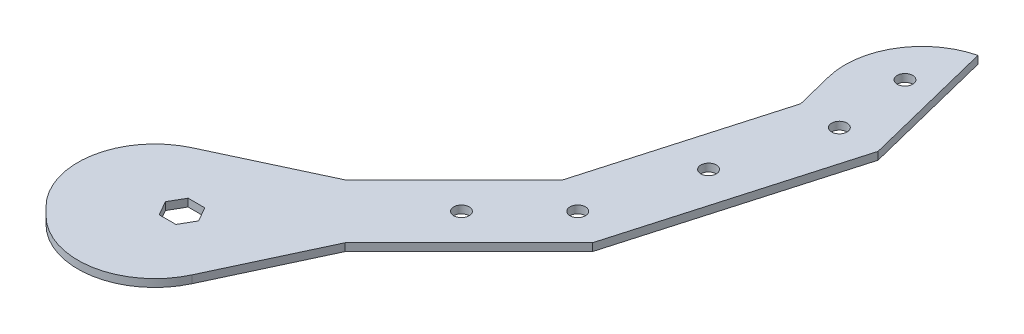
ISO-10303-21;
HEADER;
FILE_DESCRIPTION(('STEP AP214'),'2;1');
FILE_NAME('part.step','',(''),(''),'','','');
FILE_SCHEMA(('AUTOMOTIVE_DESIGN { 1 0 10303 214 1 1 1 1 }'));
ENDSEC;
DATA;
#1=APPLICATION_CONTEXT('core data for automotive mechanical design processes');
#2=APPLICATION_PROTOCOL_DEFINITION('international standard','automotive_design',2000,#1);
#3=PRODUCT_CONTEXT('',#1,'mechanical');
#4=PRODUCT('Part','Part','',(#3));
#5=PRODUCT_RELATED_PRODUCT_CATEGORY('part','',(#4));
#6=PRODUCT_DEFINITION_FORMATION('','',#4);
#7=PRODUCT_DEFINITION_CONTEXT('part definition',#1,'design');
#8=PRODUCT_DEFINITION('design','',#6,#7);
#9=PRODUCT_DEFINITION_SHAPE('','',#8);
#10=(LENGTH_UNIT() NAMED_UNIT(*) SI_UNIT(.MILLI.,.METRE.));
#11=(NAMED_UNIT(*) PLANE_ANGLE_UNIT() SI_UNIT($,.RADIAN.));
#12=(NAMED_UNIT(*) SI_UNIT($,.STERADIAN.) SOLID_ANGLE_UNIT());
#13=UNCERTAINTY_MEASURE_WITH_UNIT(LENGTH_MEASURE(1.E-05),#10,'distance_accuracy_value','');
#14=(GEOMETRIC_REPRESENTATION_CONTEXT(3) GLOBAL_UNCERTAINTY_ASSIGNED_CONTEXT((#13)) GLOBAL_UNIT_ASSIGNED_CONTEXT((#10,
#11,#12)) REPRESENTATION_CONTEXT('',''));
#15=CARTESIAN_POINT('',(0.,0.,0.));
#16=DIRECTION('',(0.,0.,1.));
#17=DIRECTION('',(1.,0.,0.));
#18=AXIS2_PLACEMENT_3D('',#15,#16,#17);
#19=CARTESIAN_POINT('',(0.,2.54,0.));
#20=DIRECTION('',(0.,1.,0.));
#21=DIRECTION('',(0.,0.,1.));
#22=AXIS2_PLACEMENT_3D('',#19,#20,#21);
#23=PLANE('',#22);
#24=CARTESIAN_POINT('',(84.5316637515031,2.54,-177.691526293164));
#25=DIRECTION('',(0.,1.,0.));
#26=DIRECTION('',(0.,0.,1.));
#27=AXIS2_PLACEMENT_3D('',#24,#25,#26);
#28=CIRCLE('',#27,2.55269999999999);
#29=CARTESIAN_POINT('',(84.5316637515031,2.54,-175.138826293164));
#30=VERTEX_POINT('',#29);
#31=EDGE_CURVE('E282',#30,#30,#28,.T.);
#32=ORIENTED_EDGE('',*,*,#31,.F.);
#33=EDGE_LOOP('',(#32));
#34=FACE_BOUND('',#33,.T.);
#35=CARTESIAN_POINT('',(87.3624440002007,2.54,-153.213816399814));
#36=DIRECTION('',(0.,1.,0.));
#37=DIRECTION('',(0.,0.,1.));
#38=AXIS2_PLACEMENT_3D('',#35,#36,#37);
#39=CIRCLE('',#38,2.55269999999999);
#40=CARTESIAN_POINT('',(87.3624440002007,2.54,-150.661116399814));
#41=VERTEX_POINT('',#40);
#42=EDGE_CURVE('E281',#41,#41,#39,.T.);
#43=ORIENTED_EDGE('',*,*,#42,.F.);
#44=EDGE_LOOP('',(#43));
#45=FACE_BOUND('',#44,.T.);
#46=CARTESIAN_POINT('',(77.7358093482921,2.54,-119.641751669168));
#47=DIRECTION('',(0.,1.,0.));
#48=DIRECTION('',(0.,0.,1.));
#49=AXIS2_PLACEMENT_3D('',#46,#47,#48);
#50=CIRCLE('',#49,2.55269999999999);
#51=CARTESIAN_POINT('',(77.7358093482921,2.54,-117.089051669168));
#52=VERTEX_POINT('',#51);
#53=EDGE_CURVE('E277',#52,#52,#50,.T.);
#54=ORIENTED_EDGE('',*,*,#53,.F.);
#55=EDGE_LOOP('',(#54));
#56=FACE_BOUND('',#55,.T.);
#57=CARTESIAN_POINT('',(68.1091746963835,2.54,-86.0696869385226));
#58=DIRECTION('',(0.,1.,0.));
#59=DIRECTION('',(0.,0.,1.));
#60=AXIS2_PLACEMENT_3D('',#57,#58,#59);
#61=CIRCLE('',#60,2.55269999999999);
#62=CARTESIAN_POINT('',(68.1091746963835,2.54,-83.5169869385226));
#63=VERTEX_POINT('',#62);
#64=EDGE_CURVE('E273',#63,#63,#61,.T.);
#65=ORIENTED_EDGE('',*,*,#64,.F.);
#66=EDGE_LOOP('',(#65));
#67=FACE_BOUND('',#66,.T.);
#68=CARTESIAN_POINT('',(48.917853565316,2.54,-66.878365807455));
#69=DIRECTION('',(0.,1.,0.));
#70=DIRECTION('',(0.,0.,1.));
#71=AXIS2_PLACEMENT_3D('',#68,#69,#70);
#72=CIRCLE('',#71,2.55269999999999);
#73=CARTESIAN_POINT('',(48.917853565316,2.54,-64.325665807455));
#74=VERTEX_POINT('',#73);
#75=EDGE_CURVE('E269',#74,#74,#72,.T.);
#76=ORIENTED_EDGE('',*,*,#75,.F.);
#77=EDGE_LOOP('',(#76));
#78=FACE_BOUND('',#77,.T.);
#79=DIRECTION('',(0.707106781186549,0.,0.707106781186546));
#80=VECTOR('',#79,1.);
#81=CARTESIAN_POINT('',(7.27589213157509,2.54,28.6451323527004));
#82=LINE('',#81,#80);
#83=CARTESIAN_POINT('',(-20.9634214125138,2.54,0.405818808611656));
#84=VERTEX_POINT('',#83);
#85=CARTESIAN_POINT('',(-18.3663310507512,2.54,3.00290917037422));
#86=VERTEX_POINT('',#85);
#87=EDGE_CURVE('E305',#84,#86,#82,.T.);
#88=ORIENTED_EDGE('',*,*,#87,.T.);
#89=CARTESIAN_POINT('',(-0.40581880861296,2.54,-14.9576030717641));
#90=DIRECTION('',(0.,1.,0.));
#91=DIRECTION('',(0.,0.,1.));
#92=AXIS2_PLACEMENT_3D('',#89,#90,#91);
#93=CIRCLE('',#92,25.4);
#94=CARTESIAN_POINT('',(22.6112329472668,2.54,-4.2163122523537));
#95=VERTEX_POINT('',#94);
#96=EDGE_CURVE('E48',#86,#95,#93,.T.);
#97=ORIENTED_EDGE('',*,*,#96,.T.);
#98=DIRECTION('',(0.42288546533112,0.,-0.906183139995267));
#99=VECTOR('',#98,1.);
#100=CARTESIAN_POINT('',(38.7067885553171,2.54,-38.7067885553189));
#101=LINE('',#100,#99);
#102=CARTESIAN_POINT('',(38.7067885553171,2.54,-38.7067885553189));
#103=VERTEX_POINT('',#102);
#104=EDGE_CURVE('E301',#95,#103,#101,.T.);
#105=ORIENTED_EDGE('',*,*,#104,.T.);
#106=DIRECTION('',(0.707106781186561,0.,-0.707106781186534));
#107=VECTOR('',#106,1.);
#108=CARTESIAN_POINT('',(38.7067885553171,2.54,-38.7067885553189));
#109=LINE('',#108,#107);
#110=CARTESIAN_POINT('',(79.5510485953113,2.54,-79.5510485953116));
#111=VERTEX_POINT('',#110);
#112=EDGE_CURVE('E304',#103,#111,#109,.T.);
#113=ORIENTED_EDGE('',*,*,#112,.T.);
#114=DIRECTION('',(0.27563735581699,0.,-0.961261695938322));
#115=VECTOR('',#114,1.);
#116=CARTESIAN_POINT('',(79.5510485953113,2.54,-79.5510485953116));
#117=LINE('',#116,#115);
#118=CARTESIAN_POINT('',(100.554615108566,2.54,-152.799189825811));
#119=VERTEX_POINT('',#118);
#120=EDGE_CURVE('E241',#111,#119,#117,.T.);
#121=ORIENTED_EDGE('',*,*,#120,.T.);
#122=DIRECTION('',(-0.241921895599665,0.,-0.970295726275997));
#123=VECTOR('',#122,1.);
#124=CARTESIAN_POINT('',(89.5985601168979,2.54,-196.741526293163));
#125=LINE('',#124,#123);
#126=CARTESIAN_POINT('',(89.5985601168979,2.54,-196.741526293163));
#127=VERTEX_POINT('',#126);
#128=EDGE_CURVE('E246',#119,#127,#125,.T.);
#129=ORIENTED_EDGE('',*,*,#128,.T.);
#130=CARTESIAN_POINT('',(95.7433762651295,2.54,-172.096014845753));
#131=DIRECTION('',(0.,1.,0.));
#132=DIRECTION('',(0.,0.,1.));
#133=AXIS2_PLACEMENT_3D('',#130,#131,#132);
#134=CIRCLE('',#133,25.4);
#135=CARTESIAN_POINT('',(71.0978648177191,2.54,-165.951198697521));
#136=VERTEX_POINT('',#135);
#137=EDGE_CURVE('E259',#127,#136,#134,.T.);
#138=ORIENTED_EDGE('',*,*,#137,.T.);
#139=DIRECTION('',(0.241921895599665,0.,0.970295726275997));
#140=VECTOR('',#139,1.);
#141=CARTESIAN_POINT('',(74.1702728918349,2.54,-153.628442973816));
#142=LINE('',#141,#140);
#143=CARTESIAN_POINT('',(74.1702728918349,2.54,-153.628442973816));
#144=VERTEX_POINT('',#143);
#145=EDGE_CURVE('E369',#136,#144,#142,.T.);
#146=ORIENTED_EDGE('',*,*,#145,.T.);
#147=DIRECTION('',(-0.275637355817012,0.,0.961261695938315));
#148=VECTOR('',#147,1.);
#149=CARTESIAN_POINT('',(74.1702728918349,2.54,-153.628442973816));
#150=LINE('',#149,#148);
#151=CARTESIAN_POINT('',(56.6673007974548,2.54,-92.5883252817334));
#152=VERTEX_POINT('',#151);
#153=EDGE_CURVE('E374',#144,#152,#150,.T.);
#154=ORIENTED_EDGE('',*,*,#153,.T.);
#155=DIRECTION('',(-0.707106781186546,0.,0.707106781186549));
#156=VECTOR('',#155,1.);
#157=CARTESIAN_POINT('',(56.6673007974548,2.54,-92.5883252817334));
#158=LINE('',#157,#156);
#159=CARTESIAN_POINT('',(20.7462763131782,2.54,-56.6673007974566));
#160=VERTEX_POINT('',#159);
#161=EDGE_CURVE('E376',#152,#160,#158,.T.);
#162=ORIENTED_EDGE('',*,*,#161,.T.);
#163=DIRECTION('',(-0.906183139995263,0.,0.422885465331128));
#164=VECTOR('',#163,1.);
#165=CARTESIAN_POINT('',(-46.60564459484,2.54,-25.2364043737144));
#166=LINE('',#165,#164);
#167=CARTESIAN_POINT('',(-13.7441999897862,2.54,-40.5717451894064));
#168=VERTEX_POINT('',#167);
#169=EDGE_CURVE('E384',#160,#168,#166,.T.);
#170=ORIENTED_EDGE('',*,*,#169,.T.);
#171=CARTESIAN_POINT('',(-3.00290917037553,2.54,-17.5546934335267));
#172=DIRECTION('',(0.,1.,0.));
#173=DIRECTION('',(0.,0.,1.));
#174=AXIS2_PLACEMENT_3D('',#171,#172,#173);
#175=CIRCLE('',#174,25.4);
#176=EDGE_CURVE('E292',#168,#84,#175,.T.);
#177=ORIENTED_EDGE('',*,*,#176,.T.);
#178=EDGE_LOOP('',(#88,#97,#105,#113,#121,#129,#138,#146,#154,#162,#170,#177));
#179=FACE_BOUND('',#178,.T.);
#180=DIRECTION('',(-0.5,0.,-0.866025403784439));
#181=VECTOR('',#180,1.);
#182=CARTESIAN_POINT('',(8.2850253850727,2.54,-20.7462763131799));
#183=LINE('',#182,#181);
#184=CARTESIAN_POINT('',(8.2850253850727,2.54,-20.7462763131799));
#185=VERTEX_POINT('',#184);
#186=CARTESIAN_POINT('',(5.53539472805711,2.54,-25.5087763131799));
#187=VERTEX_POINT('',#186);
#188=EDGE_CURVE('E179',#185,#187,#183,.T.);
#189=ORIENTED_EDGE('',*,*,#188,.F.);
#190=DIRECTION('',(0.5,0.,-0.866025403784439));
#191=VECTOR('',#190,1.);
#192=CARTESIAN_POINT('',(5.53539472805711,2.54,-15.9837763131799));
#193=LINE('',#192,#191);
#194=CARTESIAN_POINT('',(5.53539472805711,2.54,-15.9837763131799));
#195=VERTEX_POINT('',#194);
#196=EDGE_CURVE('E168',#195,#185,#193,.T.);
#197=ORIENTED_EDGE('',*,*,#196,.F.);
#198=DIRECTION('',(1.,0.,0.));
#199=VECTOR('',#198,1.);
#200=CARTESIAN_POINT('',(0.0361334140259219,2.54,-15.9837763131799));
#201=LINE('',#200,#199);
#202=CARTESIAN_POINT('',(0.0361334140259219,2.54,-15.9837763131799));
#203=VERTEX_POINT('',#202);
#204=EDGE_CURVE('E212',#203,#195,#201,.T.);
#205=ORIENTED_EDGE('',*,*,#204,.F.);
#206=DIRECTION('',(0.5,0.,0.866025403784439));
#207=VECTOR('',#206,1.);
#208=CARTESIAN_POINT('',(-2.71349724298967,2.54,-20.7462763131799));
#209=LINE('',#208,#207);
#210=CARTESIAN_POINT('',(-2.71349724298967,2.54,-20.7462763131799));
#211=VERTEX_POINT('',#210);
#212=EDGE_CURVE('E216',#211,#203,#209,.T.);
#213=ORIENTED_EDGE('',*,*,#212,.F.);
#214=DIRECTION('',(-0.5,0.,0.866025403784439));
#215=VECTOR('',#214,1.);
#216=CARTESIAN_POINT('',(0.0361334140259232,2.54,-25.5087763131799));
#217=LINE('',#216,#215);
#218=CARTESIAN_POINT('',(0.0361334140259232,2.54,-25.5087763131799));
#219=VERTEX_POINT('',#218);
#220=EDGE_CURVE('E197',#219,#211,#217,.T.);
#221=ORIENTED_EDGE('',*,*,#220,.F.);
#222=DIRECTION('',(-1.,0.,0.));
#223=VECTOR('',#222,1.);
#224=CARTESIAN_POINT('',(5.53539472805711,2.54,-25.5087763131799));
#225=LINE('',#224,#223);
#226=EDGE_CURVE('E192',#187,#219,#225,.T.);
#227=ORIENTED_EDGE('',*,*,#226,.F.);
#228=EDGE_LOOP('',(#189,#197,#205,#213,#221,#227));
#229=FACE_BOUND('',#228,.T.);
#230=ADVANCED_FACE('F40',(#34,#45,#56,#67,#78,#179,#229),#23,.T.);
#231=CARTESIAN_POINT('',(0.,0.,0.));
#232=DIRECTION('',(0.,1.,0.));
#233=DIRECTION('',(0.,0.,1.));
#234=AXIS2_PLACEMENT_3D('',#231,#232,#233);
#235=PLANE('',#234);
#236=CARTESIAN_POINT('',(84.5316637515031,0.,-177.691526293164));
#237=DIRECTION('',(0.,1.,0.));
#238=DIRECTION('',(0.,0.,1.));
#239=AXIS2_PLACEMENT_3D('',#236,#237,#238);
#240=CIRCLE('',#239,2.55269999999999);
#241=CARTESIAN_POINT('',(84.5316637515031,0.,-175.138826293164));
#242=VERTEX_POINT('',#241);
#243=EDGE_CURVE('E278',#242,#242,#240,.T.);
#244=ORIENTED_EDGE('',*,*,#243,.T.);
#245=EDGE_LOOP('',(#244));
#246=FACE_BOUND('',#245,.T.);
#247=CARTESIAN_POINT('',(87.3624440002007,0.,-153.213816399814));
#248=DIRECTION('',(0.,1.,0.));
#249=DIRECTION('',(0.,0.,1.));
#250=AXIS2_PLACEMENT_3D('',#247,#248,#249);
#251=CIRCLE('',#250,2.55269999999999);
#252=CARTESIAN_POINT('',(87.3624440002007,0.,-150.661116399814));
#253=VERTEX_POINT('',#252);
#254=EDGE_CURVE('E672',#253,#253,#251,.T.);
#255=ORIENTED_EDGE('',*,*,#254,.T.);
#256=EDGE_LOOP('',(#255));
#257=FACE_BOUND('',#256,.T.);
#258=CARTESIAN_POINT('',(77.7358093482921,0.,-119.641751669168));
#259=DIRECTION('',(0.,1.,0.));
#260=DIRECTION('',(0.,0.,1.));
#261=AXIS2_PLACEMENT_3D('',#258,#259,#260);
#262=CIRCLE('',#261,2.55269999999999);
#263=CARTESIAN_POINT('',(77.7358093482921,0.,-117.089051669168));
#264=VERTEX_POINT('',#263);
#265=EDGE_CURVE('E274',#264,#264,#262,.T.);
#266=ORIENTED_EDGE('',*,*,#265,.T.);
#267=EDGE_LOOP('',(#266));
#268=FACE_BOUND('',#267,.T.);
#269=CARTESIAN_POINT('',(68.1091746963835,0.,-86.0696869385226));
#270=DIRECTION('',(0.,1.,0.));
#271=DIRECTION('',(0.,0.,1.));
#272=AXIS2_PLACEMENT_3D('',#269,#270,#271);
#273=CIRCLE('',#272,2.55269999999999);
#274=CARTESIAN_POINT('',(68.1091746963835,0.,-83.5169869385226));
#275=VERTEX_POINT('',#274);
#276=EDGE_CURVE('E270',#275,#275,#273,.T.);
#277=ORIENTED_EDGE('',*,*,#276,.T.);
#278=EDGE_LOOP('',(#277));
#279=FACE_BOUND('',#278,.T.);
#280=CARTESIAN_POINT('',(48.917853565316,0.,-66.878365807455));
#281=DIRECTION('',(0.,1.,0.));
#282=DIRECTION('',(0.,0.,1.));
#283=AXIS2_PLACEMENT_3D('',#280,#281,#282);
#284=CIRCLE('',#283,2.55269999999999);
#285=CARTESIAN_POINT('',(48.917853565316,0.,-64.325665807455));
#286=VERTEX_POINT('',#285);
#287=EDGE_CURVE('E220',#286,#286,#284,.T.);
#288=ORIENTED_EDGE('',*,*,#287,.T.);
#289=EDGE_LOOP('',(#288));
#290=FACE_BOUND('',#289,.T.);
#291=DIRECTION('',(0.42288546533112,0.,-0.906183139995267));
#292=VECTOR('',#291,1.);
#293=CARTESIAN_POINT('',(38.7067885553171,0.,-38.7067885553189));
#294=LINE('',#293,#292);
#295=CARTESIAN_POINT('',(22.6112329472668,0.,-4.2163122523537));
#296=VERTEX_POINT('',#295);
#297=CARTESIAN_POINT('',(38.7067885553171,0.,-38.7067885553189));
#298=VERTEX_POINT('',#297);
#299=EDGE_CURVE('E327',#296,#298,#294,.T.);
#300=ORIENTED_EDGE('',*,*,#299,.F.);
#301=CARTESIAN_POINT('',(-0.40581880861296,0.,-14.9576030717641));
#302=DIRECTION('',(0.,1.,0.));
#303=DIRECTION('',(0.,0.,1.));
#304=AXIS2_PLACEMENT_3D('',#301,#302,#303);
#305=CIRCLE('',#304,25.4);
#306=CARTESIAN_POINT('',(-18.3663310507512,0.,3.00290917037422));
#307=VERTEX_POINT('',#306);
#308=EDGE_CURVE('E287',#296,#307,#305,.F.);
#309=ORIENTED_EDGE('',*,*,#308,.T.);
#310=DIRECTION('',(0.707106781186549,0.,0.707106781186546));
#311=VECTOR('',#310,1.);
#312=CARTESIAN_POINT('',(7.27589213157509,0.,28.6451323527004));
#313=LINE('',#312,#311);
#314=CARTESIAN_POINT('',(-20.9634214125138,0.,0.405818808611656));
#315=VERTEX_POINT('',#314);
#316=EDGE_CURVE('E325',#315,#307,#313,.T.);
#317=ORIENTED_EDGE('',*,*,#316,.F.);
#318=CARTESIAN_POINT('',(-3.00290917037553,0.,-17.5546934335267));
#319=DIRECTION('',(0.,1.,0.));
#320=DIRECTION('',(0.,0.,1.));
#321=AXIS2_PLACEMENT_3D('',#318,#319,#320);
#322=CIRCLE('',#321,25.4);
#323=CARTESIAN_POINT('',(-13.7441999897862,0.,-40.5717451894064));
#324=VERTEX_POINT('',#323);
#325=EDGE_CURVE('E285',#315,#324,#322,.F.);
#326=ORIENTED_EDGE('',*,*,#325,.T.);
#327=DIRECTION('',(-0.906183139995263,0.,0.422885465331128));
#328=VECTOR('',#327,1.);
#329=CARTESIAN_POINT('',(-46.60564459484,0.,-25.2364043737144));
#330=LINE('',#329,#328);
#331=CARTESIAN_POINT('',(20.7462763131782,0.,-56.6673007974566));
#332=VERTEX_POINT('',#331);
#333=EDGE_CURVE('E323',#332,#324,#330,.T.);
#334=ORIENTED_EDGE('',*,*,#333,.F.);
#335=DIRECTION('',(-0.707106781186546,0.,0.707106781186549));
#336=VECTOR('',#335,1.);
#337=CARTESIAN_POINT('',(56.6673007974548,0.,-92.5883252817334));
#338=LINE('',#337,#336);
#339=CARTESIAN_POINT('',(56.6673007974548,0.,-92.5883252817334));
#340=VERTEX_POINT('',#339);
#341=EDGE_CURVE('E321',#340,#332,#338,.T.);
#342=ORIENTED_EDGE('',*,*,#341,.F.);
#343=DIRECTION('',(-0.275637355817012,0.,0.961261695938315));
#344=VECTOR('',#343,1.);
#345=CARTESIAN_POINT('',(74.1702728918349,0.,-153.628442973816));
#346=LINE('',#345,#344);
#347=CARTESIAN_POINT('',(74.1702728918349,0.,-153.628442973816));
#348=VERTEX_POINT('',#347);
#349=EDGE_CURVE('E319',#348,#340,#346,.T.);
#350=ORIENTED_EDGE('',*,*,#349,.F.);
#351=DIRECTION('',(0.241921895599665,0.,0.970295726275997));
#352=VECTOR('',#351,1.);
#353=CARTESIAN_POINT('',(74.1702728918349,0.,-153.628442973816));
#354=LINE('',#353,#352);
#355=CARTESIAN_POINT('',(71.0978648177191,0.,-165.951198697521));
#356=VERTEX_POINT('',#355);
#357=EDGE_CURVE('E317',#356,#348,#354,.T.);
#358=ORIENTED_EDGE('',*,*,#357,.F.);
#359=CARTESIAN_POINT('',(95.7433762651295,0.,-172.096014845753));
#360=DIRECTION('',(0.,1.,0.));
#361=DIRECTION('',(0.,0.,1.));
#362=AXIS2_PLACEMENT_3D('',#359,#360,#361);
#363=CIRCLE('',#362,25.4);
#364=CARTESIAN_POINT('',(89.5985601168979,0.,-196.741526293163));
#365=VERTEX_POINT('',#364);
#366=EDGE_CURVE('E265',#356,#365,#363,.F.);
#367=ORIENTED_EDGE('',*,*,#366,.T.);
#368=DIRECTION('',(-0.241921895599665,0.,-0.970295726275997));
#369=VECTOR('',#368,1.);
#370=CARTESIAN_POINT('',(89.5985601168979,0.,-196.741526293163));
#371=LINE('',#370,#369);
#372=CARTESIAN_POINT('',(100.554615108566,0.,-152.799189825811));
#373=VERTEX_POINT('',#372);
#374=EDGE_CURVE('E314',#373,#365,#371,.T.);
#375=ORIENTED_EDGE('',*,*,#374,.F.);
#376=DIRECTION('',(0.27563735581699,0.,-0.961261695938322));
#377=VECTOR('',#376,1.);
#378=CARTESIAN_POINT('',(79.5510485953113,0.,-79.5510485953116));
#379=LINE('',#378,#377);
#380=CARTESIAN_POINT('',(79.5510485953113,0.,-79.5510485953116));
#381=VERTEX_POINT('',#380);
#382=EDGE_CURVE('E187',#381,#373,#379,.T.);
#383=ORIENTED_EDGE('',*,*,#382,.F.);
#384=DIRECTION('',(0.707106781186561,0.,-0.707106781186534));
#385=VECTOR('',#384,1.);
#386=CARTESIAN_POINT('',(38.7067885553171,0.,-38.7067885553189));
#387=LINE('',#386,#385);
#388=EDGE_CURVE('E247',#298,#381,#387,.T.);
#389=ORIENTED_EDGE('',*,*,#388,.F.);
#390=EDGE_LOOP('',(#300,#309,#317,#326,#334,#342,#350,#358,#367,#375,#383,#389));
#391=FACE_BOUND('',#390,.T.);
#392=DIRECTION('',(0.5,0.,-0.866025403784439));
#393=VECTOR('',#392,1.);
#394=CARTESIAN_POINT('',(5.53539472805711,0.,-15.9837763131799));
#395=LINE('',#394,#393);
#396=CARTESIAN_POINT('',(5.53539472805711,0.,-15.9837763131799));
#397=VERTEX_POINT('',#396);
#398=CARTESIAN_POINT('',(8.2850253850727,0.,-20.7462763131799));
#399=VERTEX_POINT('',#398);
#400=EDGE_CURVE('E218',#397,#399,#395,.T.);
#401=ORIENTED_EDGE('',*,*,#400,.T.);
#402=DIRECTION('',(-0.5,0.,-0.866025403784439));
#403=VECTOR('',#402,1.);
#404=CARTESIAN_POINT('',(8.2850253850727,0.,-20.7462763131799));
#405=LINE('',#404,#403);
#406=CARTESIAN_POINT('',(5.53539472805711,0.,-25.5087763131799));
#407=VERTEX_POINT('',#406);
#408=EDGE_CURVE('E186',#399,#407,#405,.T.);
#409=ORIENTED_EDGE('',*,*,#408,.T.);
#410=DIRECTION('',(-1.,0.,0.));
#411=VECTOR('',#410,1.);
#412=CARTESIAN_POINT('',(5.53539472805711,0.,-25.5087763131799));
#413=LINE('',#412,#411);
#414=CARTESIAN_POINT('',(0.0361334140259232,0.,-25.5087763131799));
#415=VERTEX_POINT('',#414);
#416=EDGE_CURVE('E222',#407,#415,#413,.T.);
#417=ORIENTED_EDGE('',*,*,#416,.T.);
#418=DIRECTION('',(-0.5,0.,0.866025403784439));
#419=VECTOR('',#418,1.);
#420=CARTESIAN_POINT('',(0.0361334140259232,0.,-25.5087763131799));
#421=LINE('',#420,#419);
#422=CARTESIAN_POINT('',(-2.71349724298967,0.,-20.7462763131799));
#423=VERTEX_POINT('',#422);
#424=EDGE_CURVE('E225',#415,#423,#421,.T.);
#425=ORIENTED_EDGE('',*,*,#424,.T.);
#426=DIRECTION('',(0.5,0.,0.866025403784439));
#427=VECTOR('',#426,1.);
#428=CARTESIAN_POINT('',(-2.71349724298967,0.,-20.7462763131799));
#429=LINE('',#428,#427);
#430=CARTESIAN_POINT('',(0.0361334140259219,0.,-15.9837763131799));
#431=VERTEX_POINT('',#430);
#432=EDGE_CURVE('E228',#423,#431,#429,.T.);
#433=ORIENTED_EDGE('',*,*,#432,.T.);
#434=DIRECTION('',(1.,0.,0.));
#435=VECTOR('',#434,1.);
#436=CARTESIAN_POINT('',(0.0361334140259219,0.,-15.9837763131799));
#437=LINE('',#436,#435);
#438=EDGE_CURVE('E180',#431,#397,#437,.T.);
#439=ORIENTED_EDGE('',*,*,#438,.T.);
#440=EDGE_LOOP('',(#401,#409,#417,#425,#433,#439));
#441=FACE_BOUND('',#440,.T.);
#442=ADVANCED_FACE('F357',(#246,#257,#268,#279,#290,#391,#441),#235,.F.);
#443=CARTESIAN_POINT('',(79.5510485953113,2.54,-79.5510485953116));
#444=DIRECTION('',(-0.961261695938322,0.,-0.27563735581699));
#445=DIRECTION('',(-0.27563735581699,0.,0.961261695938322));
#446=AXIS2_PLACEMENT_3D('',#443,#444,#445);
#447=PLANE('',#446);
#448=ORIENTED_EDGE('',*,*,#382,.T.);
#449=DIRECTION('',(0.,-1.,0.));
#450=VECTOR('',#449,1.);
#451=CARTESIAN_POINT('',(100.554615108566,2.54,-152.799189825811));
#452=LINE('',#451,#450);
#453=EDGE_CURVE('E347',#119,#373,#452,.T.);
#454=ORIENTED_EDGE('',*,*,#453,.F.);
#455=ORIENTED_EDGE('',*,*,#120,.F.);
#456=DIRECTION('',(0.,-1.,0.));
#457=VECTOR('',#456,1.);
#458=CARTESIAN_POINT('',(79.5510485953113,2.54,-79.5510485953116));
#459=LINE('',#458,#457);
#460=EDGE_CURVE('E311',#111,#381,#459,.T.);
#461=ORIENTED_EDGE('',*,*,#460,.T.);
#462=EDGE_LOOP('',(#448,#454,#455,#461));
#463=FACE_BOUND('',#462,.T.);
#464=ADVANCED_FACE('F415',(#463),#447,.F.);
#465=CARTESIAN_POINT('',(89.5985601168979,2.54,-196.741526293163));
#466=DIRECTION('',(-0.970295726275997,0.,0.241921895599665));
#467=DIRECTION('',(0.241921895599665,0.,0.970295726275997));
#468=AXIS2_PLACEMENT_3D('',#465,#466,#467);
#469=PLANE('',#468);
#470=ORIENTED_EDGE('',*,*,#374,.T.);
#471=DIRECTION('',(0.,-1.,0.));
#472=VECTOR('',#471,1.);
#473=CARTESIAN_POINT('',(89.5985601168979,2.54,-196.741526293163));
#474=LINE('',#473,#472);
#475=EDGE_CURVE('E344',#127,#365,#474,.T.);
#476=ORIENTED_EDGE('',*,*,#475,.F.);
#477=ORIENTED_EDGE('',*,*,#128,.F.);
#478=ORIENTED_EDGE('',*,*,#453,.T.);
#479=EDGE_LOOP('',(#470,#476,#477,#478));
#480=FACE_BOUND('',#479,.T.);
#481=ADVANCED_FACE('F364',(#480),#469,.F.);
#482=CARTESIAN_POINT('',(74.1702728918349,2.54,-153.628442973816));
#483=DIRECTION('',(0.970295726275997,0.,-0.241921895599665));
#484=DIRECTION('',(-0.241921895599665,0.,-0.970295726275997));
#485=AXIS2_PLACEMENT_3D('',#482,#483,#484);
#486=PLANE('',#485);
#487=ORIENTED_EDGE('',*,*,#145,.F.);
#488=DIRECTION('',(0.,-1.,0.));
#489=VECTOR('',#488,1.);
#490=CARTESIAN_POINT('',(71.0978648177191,2.54,-165.951198697521));
#491=LINE('',#490,#489);
#492=EDGE_CURVE('E349',#136,#356,#491,.T.);
#493=ORIENTED_EDGE('',*,*,#492,.T.);
#494=ORIENTED_EDGE('',*,*,#357,.T.);
#495=DIRECTION('',(0.,-1.,0.));
#496=VECTOR('',#495,1.);
#497=CARTESIAN_POINT('',(74.1702728918349,2.54,-153.628442973816));
#498=LINE('',#497,#496);
#499=EDGE_CURVE('E341',#144,#348,#498,.T.);
#500=ORIENTED_EDGE('',*,*,#499,.F.);
#501=EDGE_LOOP('',(#487,#493,#494,#500));
#502=FACE_BOUND('',#501,.T.);
#503=ADVANCED_FACE('F371',(#502),#486,.F.);
#504=CARTESIAN_POINT('',(74.1702728918349,2.54,-153.628442973816));
#505=DIRECTION('',(0.961261695938315,0.,0.275637355817012));
#506=DIRECTION('',(0.275637355817012,0.,-0.961261695938315));
#507=AXIS2_PLACEMENT_3D('',#504,#505,#506);
#508=PLANE('',#507);
#509=ORIENTED_EDGE('',*,*,#349,.T.);
#510=DIRECTION('',(0.,-1.,0.));
#511=VECTOR('',#510,1.);
#512=CARTESIAN_POINT('',(56.6673007974548,2.54,-92.5883252817334));
#513=LINE('',#512,#511);
#514=EDGE_CURVE('E338',#152,#340,#513,.T.);
#515=ORIENTED_EDGE('',*,*,#514,.F.);
#516=ORIENTED_EDGE('',*,*,#153,.F.);
#517=ORIENTED_EDGE('',*,*,#499,.T.);
#518=EDGE_LOOP('',(#509,#515,#516,#517));
#519=FACE_BOUND('',#518,.T.);
#520=ADVANCED_FACE('F407',(#519),#508,.F.);
#521=CARTESIAN_POINT('',(56.6673007974548,2.54,-92.5883252817334));
#522=DIRECTION('',(0.707106781186549,0.,0.707106781186546));
#523=DIRECTION('',(0.707106781186546,0.,-0.707106781186549));
#524=AXIS2_PLACEMENT_3D('',#521,#522,#523);
#525=PLANE('',#524);
#526=ORIENTED_EDGE('',*,*,#341,.T.);
#527=DIRECTION('',(0.,-1.,0.));
#528=VECTOR('',#527,1.);
#529=CARTESIAN_POINT('',(20.7462763131782,2.54,-56.6673007974566));
#530=LINE('',#529,#528);
#531=EDGE_CURVE('E335',#160,#332,#530,.T.);
#532=ORIENTED_EDGE('',*,*,#531,.F.);
#533=ORIENTED_EDGE('',*,*,#161,.F.);
#534=ORIENTED_EDGE('',*,*,#514,.T.);
#535=EDGE_LOOP('',(#526,#532,#533,#534));
#536=FACE_BOUND('',#535,.T.);
#537=ADVANCED_FACE('F394',(#536),#525,.F.);
#538=CARTESIAN_POINT('',(-46.60564459484,2.54,-25.2364043737144));
#539=DIRECTION('',(0.422885465331128,0.,0.906183139995263));
#540=DIRECTION('',(0.906183139995264,0.,-0.422885465331128));
#541=AXIS2_PLACEMENT_3D('',#538,#539,#540);
#542=PLANE('',#541);
#543=ORIENTED_EDGE('',*,*,#333,.T.);
#544=DIRECTION('',(0.,-1.,0.));
#545=VECTOR('',#544,1.);
#546=CARTESIAN_POINT('',(-13.7441999897862,2.54,-40.5717451894064));
#547=LINE('',#546,#545);
#548=EDGE_CURVE('E12',#324,#168,#547,.F.);
#549=ORIENTED_EDGE('',*,*,#548,.T.);
#550=ORIENTED_EDGE('',*,*,#169,.F.);
#551=ORIENTED_EDGE('',*,*,#531,.T.);
#552=EDGE_LOOP('',(#543,#549,#550,#551));
#553=FACE_BOUND('',#552,.T.);
#554=ADVANCED_FACE('F397',(#553),#542,.F.);
#555=CARTESIAN_POINT('',(7.27589213157509,2.54,28.6451323527004));
#556=DIRECTION('',(0.707106781186546,0.,-0.707106781186549));
#557=DIRECTION('',(-0.707106781186549,0.,-0.707106781186546));
#558=AXIS2_PLACEMENT_3D('',#555,#556,#557);
#559=PLANE('',#558);
#560=ORIENTED_EDGE('',*,*,#316,.T.);
#561=DIRECTION('',(0.,-1.,0.));
#562=VECTOR('',#561,1.);
#563=CARTESIAN_POINT('',(-18.3663310507512,2.54,3.00290917037421));
#564=LINE('',#563,#562);
#565=EDGE_CURVE('E61',#307,#86,#564,.F.);
#566=ORIENTED_EDGE('',*,*,#565,.T.);
#567=ORIENTED_EDGE('',*,*,#87,.F.);
#568=DIRECTION('',(0.,-1.,0.));
#569=VECTOR('',#568,1.);
#570=CARTESIAN_POINT('',(-20.9634214125138,2.54,0.405818808611652));
#571=LINE('',#570,#569);
#572=EDGE_CURVE('E289',#84,#315,#571,.T.);
#573=ORIENTED_EDGE('',*,*,#572,.T.);
#574=EDGE_LOOP('',(#560,#566,#567,#573));
#575=FACE_BOUND('',#574,.T.);
#576=ADVANCED_FACE('F399',(#575),#559,.F.);
#577=CARTESIAN_POINT('',(38.7067885553171,2.54,-38.7067885553189));
#578=DIRECTION('',(-0.906183139995267,0.,-0.42288546533112));
#579=DIRECTION('',(-0.42288546533112,0.,0.906183139995267));
#580=AXIS2_PLACEMENT_3D('',#577,#578,#579);
#581=PLANE('',#580);
#582=ORIENTED_EDGE('',*,*,#104,.F.);
#583=DIRECTION('',(0.,-1.,0.));
#584=VECTOR('',#583,1.);
#585=CARTESIAN_POINT('',(22.6112329472668,2.54,-4.21631225235369));
#586=LINE('',#585,#584);
#587=EDGE_CURVE('E264',#95,#296,#586,.T.);
#588=ORIENTED_EDGE('',*,*,#587,.T.);
#589=ORIENTED_EDGE('',*,*,#299,.T.);
#590=DIRECTION('',(0.,-1.,0.));
#591=VECTOR('',#590,1.);
#592=CARTESIAN_POINT('',(38.7067885553171,2.54,-38.7067885553189));
#593=LINE('',#592,#591);
#594=EDGE_CURVE('E332',#103,#298,#593,.T.);
#595=ORIENTED_EDGE('',*,*,#594,.F.);
#596=EDGE_LOOP('',(#582,#588,#589,#595));
#597=FACE_BOUND('',#596,.T.);
#598=ADVANCED_FACE('F405',(#597),#581,.F.);
#599=CARTESIAN_POINT('',(38.7067885553171,2.54,-38.7067885553189));
#600=DIRECTION('',(-0.707106781186534,0.,-0.707106781186561));
#601=DIRECTION('',(-0.707106781186561,0.,0.707106781186534));
#602=AXIS2_PLACEMENT_3D('',#599,#600,#601);
#603=PLANE('',#602);
#604=ORIENTED_EDGE('',*,*,#388,.T.);
#605=ORIENTED_EDGE('',*,*,#460,.F.);
#606=ORIENTED_EDGE('',*,*,#112,.F.);
#607=ORIENTED_EDGE('',*,*,#594,.T.);
#608=EDGE_LOOP('',(#604,#605,#606,#607));
#609=FACE_BOUND('',#608,.T.);
#610=ADVANCED_FACE('F423',(#609),#603,.F.);
#611=CARTESIAN_POINT('',(5.53539472805711,2.54,-15.9837763131799));
#612=DIRECTION('',(-0.866025403784439,0.,-0.5));
#613=DIRECTION('',(-0.5,0.,0.866025403784439));
#614=AXIS2_PLACEMENT_3D('',#611,#612,#613);
#615=PLANE('',#614);
#616=ORIENTED_EDGE('',*,*,#400,.F.);
#617=DIRECTION('',(0.,-1.,0.));
#618=VECTOR('',#617,1.);
#619=CARTESIAN_POINT('',(5.53539472805711,2.54,-15.9837763131799));
#620=LINE('',#619,#618);
#621=EDGE_CURVE('E174',#195,#397,#620,.T.);
#622=ORIENTED_EDGE('',*,*,#621,.F.);
#623=ORIENTED_EDGE('',*,*,#196,.T.);
#624=DIRECTION('',(0.,-1.,0.));
#625=VECTOR('',#624,1.);
#626=CARTESIAN_POINT('',(8.2850253850727,2.54,-20.7462763131799));
#627=LINE('',#626,#625);
#628=EDGE_CURVE('E171',#185,#399,#627,.T.);
#629=ORIENTED_EDGE('',*,*,#628,.T.);
#630=EDGE_LOOP('',(#616,#622,#623,#629));
#631=FACE_BOUND('',#630,.T.);
#632=ADVANCED_FACE('F170',(#631),#615,.T.);
#633=CARTESIAN_POINT('',(8.2850253850727,2.54,-20.7462763131799));
#634=DIRECTION('',(-0.866025403784439,0.,0.5));
#635=DIRECTION('',(0.5,0.,0.866025403784439));
#636=AXIS2_PLACEMENT_3D('',#633,#634,#635);
#637=PLANE('',#636);
#638=ORIENTED_EDGE('',*,*,#408,.F.);
#639=ORIENTED_EDGE('',*,*,#628,.F.);
#640=ORIENTED_EDGE('',*,*,#188,.T.);
#641=DIRECTION('',(0.,-1.,0.));
#642=VECTOR('',#641,1.);
#643=CARTESIAN_POINT('',(5.53539472805711,2.54,-25.5087763131799));
#644=LINE('',#643,#642);
#645=EDGE_CURVE('E188',#187,#407,#644,.T.);
#646=ORIENTED_EDGE('',*,*,#645,.T.);
#647=EDGE_LOOP('',(#638,#639,#640,#646));
#648=FACE_BOUND('',#647,.T.);
#649=ADVANCED_FACE('F183',(#648),#637,.T.);
#650=CARTESIAN_POINT('',(5.53539472805711,2.54,-25.5087763131799));
#651=DIRECTION('',(0.,0.,1.));
#652=DIRECTION('',(1.,0.,0.));
#653=AXIS2_PLACEMENT_3D('',#650,#651,#652);
#654=PLANE('',#653);
#655=ORIENTED_EDGE('',*,*,#416,.F.);
#656=ORIENTED_EDGE('',*,*,#645,.F.);
#657=ORIENTED_EDGE('',*,*,#226,.T.);
#658=DIRECTION('',(0.,-1.,0.));
#659=VECTOR('',#658,1.);
#660=CARTESIAN_POINT('',(0.0361334140259232,2.54,-25.5087763131799));
#661=LINE('',#660,#659);
#662=EDGE_CURVE('E238',#219,#415,#661,.T.);
#663=ORIENTED_EDGE('',*,*,#662,.T.);
#664=EDGE_LOOP('',(#655,#656,#657,#663));
#665=FACE_BOUND('',#664,.T.);
#666=ADVANCED_FACE('F496',(#665),#654,.T.);
#667=CARTESIAN_POINT('',(0.0361334140259232,2.54,-25.5087763131799));
#668=DIRECTION('',(0.866025403784439,0.,0.5));
#669=DIRECTION('',(0.5,0.,-0.866025403784439));
#670=AXIS2_PLACEMENT_3D('',#667,#668,#669);
#671=PLANE('',#670);
#672=ORIENTED_EDGE('',*,*,#424,.F.);
#673=ORIENTED_EDGE('',*,*,#662,.F.);
#674=ORIENTED_EDGE('',*,*,#220,.T.);
#675=DIRECTION('',(0.,-1.,0.));
#676=VECTOR('',#675,1.);
#677=CARTESIAN_POINT('',(-2.71349724298967,2.54,-20.7462763131799));
#678=LINE('',#677,#676);
#679=EDGE_CURVE('E236',#211,#423,#678,.T.);
#680=ORIENTED_EDGE('',*,*,#679,.T.);
#681=EDGE_LOOP('',(#672,#673,#674,#680));
#682=FACE_BOUND('',#681,.T.);
#683=ADVANCED_FACE('F492',(#682),#671,.T.);
#684=CARTESIAN_POINT('',(-2.71349724298967,2.54,-20.7462763131799));
#685=DIRECTION('',(0.866025403784439,0.,-0.5));
#686=DIRECTION('',(-0.5,0.,-0.866025403784439));
#687=AXIS2_PLACEMENT_3D('',#684,#685,#686);
#688=PLANE('',#687);
#689=ORIENTED_EDGE('',*,*,#432,.F.);
#690=ORIENTED_EDGE('',*,*,#679,.F.);
#691=ORIENTED_EDGE('',*,*,#212,.T.);
#692=DIRECTION('',(0.,-1.,0.));
#693=VECTOR('',#692,1.);
#694=CARTESIAN_POINT('',(0.0361334140259219,2.54,-15.9837763131799));
#695=LINE('',#694,#693);
#696=EDGE_CURVE('E234',#203,#431,#695,.T.);
#697=ORIENTED_EDGE('',*,*,#696,.T.);
#698=EDGE_LOOP('',(#689,#690,#691,#697));
#699=FACE_BOUND('',#698,.T.);
#700=ADVANCED_FACE('F488',(#699),#688,.T.);
#701=CARTESIAN_POINT('',(0.0361334140259219,2.54,-15.9837763131799));
#702=DIRECTION('',(0.,0.,-1.));
#703=DIRECTION('',(-1.,0.,0.));
#704=AXIS2_PLACEMENT_3D('',#701,#702,#703);
#705=PLANE('',#704);
#706=ORIENTED_EDGE('',*,*,#438,.F.);
#707=ORIENTED_EDGE('',*,*,#696,.F.);
#708=ORIENTED_EDGE('',*,*,#204,.T.);
#709=ORIENTED_EDGE('',*,*,#621,.T.);
#710=EDGE_LOOP('',(#706,#707,#708,#709));
#711=FACE_BOUND('',#710,.T.);
#712=ADVANCED_FACE('F457',(#711),#705,.T.);
#713=CARTESIAN_POINT('',(95.7433762651295,2.54,-172.096014845753));
#714=DIRECTION('',(0.,-1.,0.));
#715=DIRECTION('',(0.,0.,-1.));
#716=AXIS2_PLACEMENT_3D('',#713,#714,#715);
#717=CYLINDRICAL_SURFACE('',#716,25.4);
#718=ORIENTED_EDGE('',*,*,#137,.F.);
#719=ORIENTED_EDGE('',*,*,#475,.T.);
#720=ORIENTED_EDGE('',*,*,#366,.F.);
#721=ORIENTED_EDGE('',*,*,#492,.F.);
#722=EDGE_LOOP('',(#718,#719,#720,#721));
#723=FACE_BOUND('',#722,.T.);
#724=ADVANCED_FACE('F367',(#723),#717,.T.);
#725=CARTESIAN_POINT('',(48.917853565316,2.54,-66.878365807455));
#726=DIRECTION('',(0.,1.,0.));
#727=DIRECTION('',(0.,0.,1.));
#728=AXIS2_PLACEMENT_3D('',#725,#726,#727);
#729=CYLINDRICAL_SURFACE('',#728,2.55269999999999);
#730=ORIENTED_EDGE('',*,*,#75,.T.);
#731=EDGE_LOOP('',(#730));
#732=FACE_BOUND('',#731,.T.);
#733=ORIENTED_EDGE('',*,*,#287,.F.);
#734=EDGE_LOOP('',(#733));
#735=FACE_BOUND('',#734,.T.);
#736=ADVANCED_FACE('F456',(#732,#735),#729,.F.);
#737=CARTESIAN_POINT('',(68.1091746963835,2.54,-86.0696869385226));
#738=DIRECTION('',(0.,1.,0.));
#739=DIRECTION('',(0.,0.,1.));
#740=AXIS2_PLACEMENT_3D('',#737,#738,#739);
#741=CYLINDRICAL_SURFACE('',#740,2.55269999999999);
#742=ORIENTED_EDGE('',*,*,#64,.T.);
#743=EDGE_LOOP('',(#742));
#744=FACE_BOUND('',#743,.T.);
#745=ORIENTED_EDGE('',*,*,#276,.F.);
#746=EDGE_LOOP('',(#745));
#747=FACE_BOUND('',#746,.T.);
#748=ADVANCED_FACE('F478',(#744,#747),#741,.F.);
#749=CARTESIAN_POINT('',(77.7358093482921,2.54,-119.641751669168));
#750=DIRECTION('',(0.,1.,0.));
#751=DIRECTION('',(0.,0.,1.));
#752=AXIS2_PLACEMENT_3D('',#749,#750,#751);
#753=CYLINDRICAL_SURFACE('',#752,2.55269999999999);
#754=ORIENTED_EDGE('',*,*,#53,.T.);
#755=EDGE_LOOP('',(#754));
#756=FACE_BOUND('',#755,.T.);
#757=ORIENTED_EDGE('',*,*,#265,.F.);
#758=EDGE_LOOP('',(#757));
#759=FACE_BOUND('',#758,.T.);
#760=ADVANCED_FACE('F470',(#756,#759),#753,.F.);
#761=CARTESIAN_POINT('',(87.3624440002007,2.54,-153.213816399814));
#762=DIRECTION('',(0.,1.,0.));
#763=DIRECTION('',(0.,0.,1.));
#764=AXIS2_PLACEMENT_3D('',#761,#762,#763);
#765=CYLINDRICAL_SURFACE('',#764,2.55269999999999);
#766=ORIENTED_EDGE('',*,*,#42,.T.);
#767=EDGE_LOOP('',(#766));
#768=FACE_BOUND('',#767,.T.);
#769=ORIENTED_EDGE('',*,*,#254,.F.);
#770=EDGE_LOOP('',(#769));
#771=FACE_BOUND('',#770,.T.);
#772=ADVANCED_FACE('F464',(#768,#771),#765,.F.);
#773=CARTESIAN_POINT('',(84.5316637515031,2.54,-177.691526293164));
#774=DIRECTION('',(0.,1.,0.));
#775=DIRECTION('',(0.,0.,1.));
#776=AXIS2_PLACEMENT_3D('',#773,#774,#775);
#777=CYLINDRICAL_SURFACE('',#776,2.55269999999999);
#778=ORIENTED_EDGE('',*,*,#31,.T.);
#779=EDGE_LOOP('',(#778));
#780=FACE_BOUND('',#779,.T.);
#781=ORIENTED_EDGE('',*,*,#243,.F.);
#782=EDGE_LOOP('',(#781));
#783=FACE_BOUND('',#782,.T.);
#784=ADVANCED_FACE('F459',(#780,#783),#777,.F.);
#785=CARTESIAN_POINT('',(-0.40581880861296,2.54,-14.9576030717641));
#786=DIRECTION('',(0.,-1.,0.));
#787=DIRECTION('',(0.,0.,-1.));
#788=AXIS2_PLACEMENT_3D('',#785,#786,#787);
#789=CYLINDRICAL_SURFACE('',#788,25.4);
#790=ORIENTED_EDGE('',*,*,#96,.F.);
#791=ORIENTED_EDGE('',*,*,#565,.F.);
#792=ORIENTED_EDGE('',*,*,#308,.F.);
#793=ORIENTED_EDGE('',*,*,#587,.F.);
#794=EDGE_LOOP('',(#790,#791,#792,#793));
#795=FACE_BOUND('',#794,.T.);
#796=ADVANCED_FACE('F437',(#795),#789,.T.);
#797=CARTESIAN_POINT('',(-3.00290917037553,2.54,-17.5546934335267));
#798=DIRECTION('',(0.,-1.,0.));
#799=DIRECTION('',(0.,0.,-1.));
#800=AXIS2_PLACEMENT_3D('',#797,#798,#799);
#801=CYLINDRICAL_SURFACE('',#800,25.4);
#802=ORIENTED_EDGE('',*,*,#176,.F.);
#803=ORIENTED_EDGE('',*,*,#548,.F.);
#804=ORIENTED_EDGE('',*,*,#325,.F.);
#805=ORIENTED_EDGE('',*,*,#572,.F.);
#806=EDGE_LOOP('',(#802,#803,#804,#805));
#807=FACE_BOUND('',#806,.T.);
#808=ADVANCED_FACE('F42',(#807),#801,.T.);
#809=CLOSED_SHELL('',(#230,#442,#464,#481,#503,#520,#537,#554,#576,#598,#610,#632,#649,#666,
#683,#700,#712,#724,#736,#748,#760,#772,#784,#796,#808));
#810=MANIFOLD_SOLID_BREP('B2',#809);
#811=ADVANCED_BREP_SHAPE_REPRESENTATION('',(#18,#810),#14);
#812=SHAPE_DEFINITION_REPRESENTATION(#9,#811);
ENDSEC;
END-ISO-10303-21;
